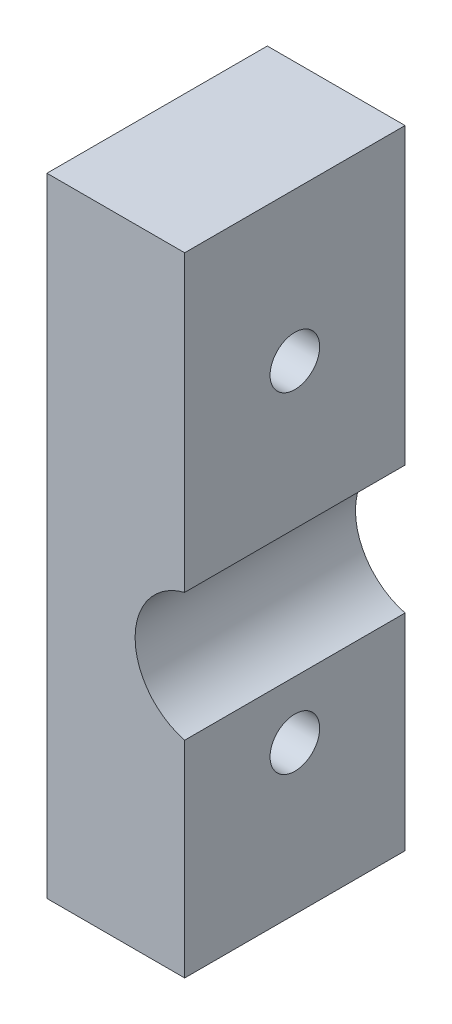
ISO-10303-21;
HEADER;
FILE_DESCRIPTION(('STEP AP214'),'2;1');
FILE_NAME('part.step','',(''),(''),'','','');
FILE_SCHEMA(('AUTOMOTIVE_DESIGN { 1 0 10303 214 1 1 1 1 }'));
ENDSEC;
DATA;
#1=APPLICATION_CONTEXT('core data for automotive mechanical design processes');
#2=APPLICATION_PROTOCOL_DEFINITION('international standard','automotive_design',2000,#1);
#3=PRODUCT_CONTEXT('',#1,'mechanical');
#4=PRODUCT('Part','Part','',(#3));
#5=PRODUCT_RELATED_PRODUCT_CATEGORY('part','',(#4));
#6=PRODUCT_DEFINITION_FORMATION('','',#4);
#7=PRODUCT_DEFINITION_CONTEXT('part definition',#1,'design');
#8=PRODUCT_DEFINITION('design','',#6,#7);
#9=PRODUCT_DEFINITION_SHAPE('','',#8);
#10=(LENGTH_UNIT() NAMED_UNIT(*) SI_UNIT(.MILLI.,.METRE.));
#11=(NAMED_UNIT(*) PLANE_ANGLE_UNIT() SI_UNIT($,.RADIAN.));
#12=(NAMED_UNIT(*) SI_UNIT($,.STERADIAN.) SOLID_ANGLE_UNIT());
#13=UNCERTAINTY_MEASURE_WITH_UNIT(LENGTH_MEASURE(1.E-05),#10,'distance_accuracy_value','');
#14=(GEOMETRIC_REPRESENTATION_CONTEXT(3) GLOBAL_UNCERTAINTY_ASSIGNED_CONTEXT((#13)) GLOBAL_UNIT_ASSIGNED_CONTEXT((#10,
#11,#12)) REPRESENTATION_CONTEXT('',''));
#15=CARTESIAN_POINT('',(0.,0.,0.));
#16=DIRECTION('',(0.,0.,1.));
#17=DIRECTION('',(1.,0.,0.));
#18=AXIS2_PLACEMENT_3D('',#15,#16,#17);
#19=CARTESIAN_POINT('',(-14.,32.5,10.));
#20=DIRECTION('',(1.,0.,0.));
#21=DIRECTION('',(0.,1.,0.));
#22=AXIS2_PLACEMENT_3D('',#19,#20,#21);
#23=PLANE('',#22);
#24=CARTESIAN_POINT('',(-14.,-11.,0.));
#25=DIRECTION('',(-1.,0.,0.));
#26=DIRECTION('',(0.,0.,1.));
#27=AXIS2_PLACEMENT_3D('',#24,#25,#26);
#28=CIRCLE('',#27,5.);
#29=CARTESIAN_POINT('',(-14.,-11.,5.));
#30=VERTEX_POINT('',#29);
#31=EDGE_CURVE('E183',#30,#30,#28,.T.);
#32=ORIENTED_EDGE('',*,*,#31,.F.);
#33=EDGE_LOOP('',(#32));
#34=FACE_BOUND('',#33,.T.);
#35=CARTESIAN_POINT('',(-14.,19.,0.));
#36=DIRECTION('',(-1.,0.,0.));
#37=DIRECTION('',(0.,0.,1.));
#38=AXIS2_PLACEMENT_3D('',#35,#36,#37);
#39=CIRCLE('',#38,5.);
#40=CARTESIAN_POINT('',(-14.,19.,5.));
#41=VERTEX_POINT('',#40);
#42=EDGE_CURVE('E150',#41,#41,#39,.T.);
#43=ORIENTED_EDGE('',*,*,#42,.F.);
#44=EDGE_LOOP('',(#43));
#45=FACE_BOUND('',#44,.T.);
#46=DIRECTION('',(0.,-1.,0.));
#47=VECTOR('',#46,1.);
#48=CARTESIAN_POINT('',(-14.,32.5,-10.));
#49=LINE('',#48,#47);
#50=CARTESIAN_POINT('',(-14.,32.5,-10.));
#51=VERTEX_POINT('',#50);
#52=CARTESIAN_POINT('',(-14.,-24.5,-10.));
#53=VERTEX_POINT('',#52);
#54=EDGE_CURVE('E124',#51,#53,#49,.T.);
#55=ORIENTED_EDGE('',*,*,#54,.T.);
#56=DIRECTION('',(0.,0.,-1.));
#57=VECTOR('',#56,1.);
#58=CARTESIAN_POINT('',(-14.,-24.5,10.));
#59=LINE('',#58,#57);
#60=CARTESIAN_POINT('',(-14.,-24.5,10.));
#61=VERTEX_POINT('',#60);
#62=EDGE_CURVE('E11',#61,#53,#59,.T.);
#63=ORIENTED_EDGE('',*,*,#62,.F.);
#64=DIRECTION('',(0.,-1.,0.));
#65=VECTOR('',#64,1.);
#66=CARTESIAN_POINT('',(-14.,32.5,10.));
#67=LINE('',#66,#65);
#68=CARTESIAN_POINT('',(-14.,32.5,10.));
#69=VERTEX_POINT('',#68);
#70=EDGE_CURVE('E135',#69,#61,#67,.T.);
#71=ORIENTED_EDGE('',*,*,#70,.F.);
#72=DIRECTION('',(0.,0.,-1.));
#73=VECTOR('',#72,1.);
#74=CARTESIAN_POINT('',(-14.,32.5,10.));
#75=LINE('',#74,#73);
#76=EDGE_CURVE('E120',#69,#51,#75,.T.);
#77=ORIENTED_EDGE('',*,*,#76,.T.);
#78=EDGE_LOOP('',(#55,#63,#71,#77));
#79=FACE_BOUND('',#78,.T.);
#80=ADVANCED_FACE('F38',(#34,#45,#79),#23,.F.);
#81=CARTESIAN_POINT('',(-14.,-24.5,10.));
#82=DIRECTION('',(0.,1.,0.));
#83=DIRECTION('',(0.,0.,1.));
#84=AXIS2_PLACEMENT_3D('',#81,#82,#83);
#85=PLANE('',#84);
#86=DIRECTION('',(1.,0.,0.));
#87=VECTOR('',#86,1.);
#88=CARTESIAN_POINT('',(-14.,-24.5,-10.));
#89=LINE('',#88,#87);
#90=CARTESIAN_POINT('',(-1.50000000000001,-24.5,-10.));
#91=VERTEX_POINT('',#90);
#92=EDGE_CURVE('E127',#53,#91,#89,.T.);
#93=ORIENTED_EDGE('',*,*,#92,.T.);
#94=DIRECTION('',(0.,0.,-1.));
#95=VECTOR('',#94,1.);
#96=CARTESIAN_POINT('',(-1.50000000000001,-24.5,10.));
#97=LINE('',#96,#95);
#98=CARTESIAN_POINT('',(-1.50000000000001,-24.5,10.));
#99=VERTEX_POINT('',#98);
#100=EDGE_CURVE('E47',#99,#91,#97,.T.);
#101=ORIENTED_EDGE('',*,*,#100,.F.);
#102=DIRECTION('',(1.,0.,0.));
#103=VECTOR('',#102,1.);
#104=CARTESIAN_POINT('',(-14.,-24.5,10.));
#105=LINE('',#104,#103);
#106=EDGE_CURVE('E93',#61,#99,#105,.T.);
#107=ORIENTED_EDGE('',*,*,#106,.F.);
#108=ORIENTED_EDGE('',*,*,#62,.T.);
#109=EDGE_LOOP('',(#93,#101,#107,#108));
#110=FACE_BOUND('',#109,.T.);
#111=ADVANCED_FACE('F157',(#110),#85,.F.);
#112=CARTESIAN_POINT('',(-1.5,-5.80947501931112,10.));
#113=DIRECTION('',(-1.,0.,0.));
#114=DIRECTION('',(0.,-1.,0.));
#115=AXIS2_PLACEMENT_3D('',#112,#113,#114);
#116=PLANE('',#115);
#117=CARTESIAN_POINT('',(-1.5,-11.,0.));
#118=DIRECTION('',(-1.,0.,0.));
#119=DIRECTION('',(0.,-1.,0.));
#120=AXIS2_PLACEMENT_3D('',#117,#118,#119);
#121=CIRCLE('',#120,2.25);
#122=CARTESIAN_POINT('',(-1.50000000000001,-13.25,0.));
#123=VERTEX_POINT('',#122);
#124=EDGE_CURVE('E41',#123,#123,#121,.T.);
#125=ORIENTED_EDGE('',*,*,#124,.T.);
#126=EDGE_LOOP('',(#125));
#127=FACE_BOUND('',#126,.T.);
#128=DIRECTION('',(0.,1.,0.));
#129=VECTOR('',#128,1.);
#130=CARTESIAN_POINT('',(-1.5,-5.80947501931112,-10.));
#131=LINE('',#130,#129);
#132=CARTESIAN_POINT('',(-1.50000000000001,-5.80947501931112,-10.));
#133=VERTEX_POINT('',#132);
#134=EDGE_CURVE('E130',#91,#133,#131,.T.);
#135=ORIENTED_EDGE('',*,*,#134,.T.);
#136=DIRECTION('',(0.,0.,-1.));
#137=VECTOR('',#136,1.);
#138=CARTESIAN_POINT('',(-1.50000000000001,-5.80947501931112,10.));
#139=LINE('',#138,#137);
#140=CARTESIAN_POINT('',(-1.50000000000001,-5.80947501931112,10.));
#141=VERTEX_POINT('',#140);
#142=EDGE_CURVE('E115',#141,#133,#139,.T.);
#143=ORIENTED_EDGE('',*,*,#142,.F.);
#144=DIRECTION('',(0.,1.,0.));
#145=VECTOR('',#144,1.);
#146=CARTESIAN_POINT('',(-1.5,-5.80947501931112,10.));
#147=LINE('',#146,#145);
#148=EDGE_CURVE('E106',#99,#141,#147,.T.);
#149=ORIENTED_EDGE('',*,*,#148,.F.);
#150=ORIENTED_EDGE('',*,*,#100,.T.);
#151=EDGE_LOOP('',(#135,#143,#149,#150));
#152=FACE_BOUND('',#151,.T.);
#153=ADVANCED_FACE('F160',(#127,#152),#116,.F.);
#154=CARTESIAN_POINT('',(0.,0.,10.));
#155=DIRECTION('',(0.,0.,-1.));
#156=DIRECTION('',(-1.,0.,0.));
#157=AXIS2_PLACEMENT_3D('',#154,#155,#156);
#158=CYLINDRICAL_SURFACE('',#157,6.);
#159=CARTESIAN_POINT('',(0.,0.,-10.));
#160=DIRECTION('',(0.,0.,-1.));
#161=DIRECTION('',(1.,0.,0.));
#162=AXIS2_PLACEMENT_3D('',#159,#160,#161);
#163=CIRCLE('',#162,6.);
#164=CARTESIAN_POINT('',(-1.5,5.80947501931112,-10.));
#165=VERTEX_POINT('',#164);
#166=EDGE_CURVE('E114',#133,#165,#163,.T.);
#167=ORIENTED_EDGE('',*,*,#166,.T.);
#168=DIRECTION('',(0.,0.,-1.));
#169=VECTOR('',#168,1.);
#170=CARTESIAN_POINT('',(-1.5,5.80947501931112,10.));
#171=LINE('',#170,#169);
#172=CARTESIAN_POINT('',(-1.5,5.80947501931112,10.));
#173=VERTEX_POINT('',#172);
#174=EDGE_CURVE('E111',#173,#165,#171,.T.);
#175=ORIENTED_EDGE('',*,*,#174,.F.);
#176=CARTESIAN_POINT('',(0.,0.,10.));
#177=DIRECTION('',(0.,0.,-1.));
#178=DIRECTION('',(1.,0.,0.));
#179=AXIS2_PLACEMENT_3D('',#176,#177,#178);
#180=CIRCLE('',#179,6.);
#181=EDGE_CURVE('E100',#141,#173,#180,.T.);
#182=ORIENTED_EDGE('',*,*,#181,.F.);
#183=ORIENTED_EDGE('',*,*,#142,.T.);
#184=EDGE_LOOP('',(#167,#175,#182,#183));
#185=FACE_BOUND('',#184,.T.);
#186=ADVANCED_FACE('F112',(#185),#158,.F.);
#187=CARTESIAN_POINT('',(-1.5,32.5,10.));
#188=DIRECTION('',(-1.,0.,0.));
#189=DIRECTION('',(0.,-1.,0.));
#190=AXIS2_PLACEMENT_3D('',#187,#188,#189);
#191=PLANE('',#190);
#192=CARTESIAN_POINT('',(-1.5,19.,0.));
#193=DIRECTION('',(-1.,0.,0.));
#194=DIRECTION('',(0.,-1.,0.));
#195=AXIS2_PLACEMENT_3D('',#192,#193,#194);
#196=CIRCLE('',#195,2.25);
#197=CARTESIAN_POINT('',(-1.5,16.75,0.));
#198=VERTEX_POINT('',#197);
#199=EDGE_CURVE('E128',#198,#198,#196,.T.);
#200=ORIENTED_EDGE('',*,*,#199,.T.);
#201=EDGE_LOOP('',(#200));
#202=FACE_BOUND('',#201,.T.);
#203=DIRECTION('',(0.,1.,0.));
#204=VECTOR('',#203,1.);
#205=CARTESIAN_POINT('',(-1.5,32.5,-10.));
#206=LINE('',#205,#204);
#207=CARTESIAN_POINT('',(-1.5,32.5,-10.));
#208=VERTEX_POINT('',#207);
#209=EDGE_CURVE('E79',#165,#208,#206,.T.);
#210=ORIENTED_EDGE('',*,*,#209,.T.);
#211=DIRECTION('',(0.,0.,-1.));
#212=VECTOR('',#211,1.);
#213=CARTESIAN_POINT('',(-1.5,32.5,10.));
#214=LINE('',#213,#212);
#215=CARTESIAN_POINT('',(-1.5,32.5,10.));
#216=VERTEX_POINT('',#215);
#217=EDGE_CURVE('E116',#216,#208,#214,.T.);
#218=ORIENTED_EDGE('',*,*,#217,.F.);
#219=DIRECTION('',(0.,1.,0.));
#220=VECTOR('',#219,1.);
#221=CARTESIAN_POINT('',(-1.5,32.5,10.));
#222=LINE('',#221,#220);
#223=EDGE_CURVE('E104',#173,#216,#222,.T.);
#224=ORIENTED_EDGE('',*,*,#223,.F.);
#225=ORIENTED_EDGE('',*,*,#174,.T.);
#226=EDGE_LOOP('',(#210,#218,#224,#225));
#227=FACE_BOUND('',#226,.T.);
#228=ADVANCED_FACE('F118',(#202,#227),#191,.F.);
#229=CARTESIAN_POINT('',(-14.,32.5,10.));
#230=DIRECTION('',(0.,-1.,0.));
#231=DIRECTION('',(0.,0.,-1.));
#232=AXIS2_PLACEMENT_3D('',#229,#230,#231);
#233=PLANE('',#232);
#234=DIRECTION('',(-1.,0.,0.));
#235=VECTOR('',#234,1.);
#236=CARTESIAN_POINT('',(-14.,32.5,-10.));
#237=LINE('',#236,#235);
#238=EDGE_CURVE('E85',#208,#51,#237,.T.);
#239=ORIENTED_EDGE('',*,*,#238,.T.);
#240=ORIENTED_EDGE('',*,*,#76,.F.);
#241=DIRECTION('',(-1.,0.,0.));
#242=VECTOR('',#241,1.);
#243=CARTESIAN_POINT('',(-14.,32.5,10.));
#244=LINE('',#243,#242);
#245=EDGE_CURVE('E56',#216,#69,#244,.T.);
#246=ORIENTED_EDGE('',*,*,#245,.F.);
#247=ORIENTED_EDGE('',*,*,#217,.T.);
#248=EDGE_LOOP('',(#239,#240,#246,#247));
#249=FACE_BOUND('',#248,.T.);
#250=ADVANCED_FACE('F165',(#249),#233,.F.);
#251=CARTESIAN_POINT('',(0.,0.,10.));
#252=DIRECTION('',(0.,0.,1.));
#253=DIRECTION('',(1.,0.,0.));
#254=AXIS2_PLACEMENT_3D('',#251,#252,#253);
#255=PLANE('',#254);
#256=ORIENTED_EDGE('',*,*,#70,.T.);
#257=ORIENTED_EDGE('',*,*,#106,.T.);
#258=ORIENTED_EDGE('',*,*,#148,.T.);
#259=ORIENTED_EDGE('',*,*,#181,.T.);
#260=ORIENTED_EDGE('',*,*,#223,.T.);
#261=ORIENTED_EDGE('',*,*,#245,.T.);
#262=EDGE_LOOP('',(#256,#257,#258,#259,#260,#261));
#263=FACE_BOUND('',#262,.T.);
#264=ADVANCED_FACE('F102',(#263),#255,.T.);
#265=CARTESIAN_POINT('',(0.,0.,-10.));
#266=DIRECTION('',(0.,0.,1.));
#267=DIRECTION('',(1.,0.,0.));
#268=AXIS2_PLACEMENT_3D('',#265,#266,#267);
#269=PLANE('',#268);
#270=ORIENTED_EDGE('',*,*,#54,.F.);
#271=ORIENTED_EDGE('',*,*,#238,.F.);
#272=ORIENTED_EDGE('',*,*,#209,.F.);
#273=ORIENTED_EDGE('',*,*,#166,.F.);
#274=ORIENTED_EDGE('',*,*,#134,.F.);
#275=ORIENTED_EDGE('',*,*,#92,.F.);
#276=EDGE_LOOP('',(#270,#271,#272,#273,#274,#275));
#277=FACE_BOUND('',#276,.T.);
#278=ADVANCED_FACE('F163',(#277),#269,.F.);
#279=CARTESIAN_POINT('',(-14.,19.,0.));
#280=DIRECTION('',(-1.,0.,0.));
#281=DIRECTION('',(0.,0.,1.));
#282=AXIS2_PLACEMENT_3D('',#279,#280,#281);
#283=CYLINDRICAL_SURFACE('',#282,2.25);
#284=CARTESIAN_POINT('',(-8.09999999999999,19.,0.));
#285=DIRECTION('',(-1.,0.,0.));
#286=DIRECTION('',(0.,0.,1.));
#287=AXIS2_PLACEMENT_3D('',#284,#285,#286);
#288=CIRCLE('',#287,2.25);
#289=CARTESIAN_POINT('',(-8.09999999999999,19.,2.25));
#290=VERTEX_POINT('',#289);
#291=EDGE_CURVE('E141',#290,#290,#288,.T.);
#292=ORIENTED_EDGE('',*,*,#291,.T.);
#293=EDGE_LOOP('',(#292));
#294=FACE_BOUND('',#293,.T.);
#295=ORIENTED_EDGE('',*,*,#199,.F.);
#296=EDGE_LOOP('',(#295));
#297=FACE_BOUND('',#296,.T.);
#298=ADVANCED_FACE('F219',(#294,#297),#283,.F.);
#299=CARTESIAN_POINT('',(-8.09999999999999,21.25,0.));
#300=DIRECTION('',(1.,0.,0.));
#301=DIRECTION('',(0.,0.,-1.));
#302=AXIS2_PLACEMENT_3D('',#299,#300,#301);
#303=PLANE('',#302);
#304=ORIENTED_EDGE('',*,*,#291,.F.);
#305=EDGE_LOOP('',(#304));
#306=FACE_BOUND('',#305,.T.);
#307=CARTESIAN_POINT('',(-8.09999999999999,19.,0.));
#308=DIRECTION('',(-1.,0.,0.));
#309=DIRECTION('',(0.,0.,1.));
#310=AXIS2_PLACEMENT_3D('',#307,#308,#309);
#311=CIRCLE('',#310,5.);
#312=CARTESIAN_POINT('',(-8.09999999999999,19.,5.));
#313=VERTEX_POINT('',#312);
#314=EDGE_CURVE('E145',#313,#313,#311,.T.);
#315=ORIENTED_EDGE('',*,*,#314,.T.);
#316=EDGE_LOOP('',(#315));
#317=FACE_BOUND('',#316,.T.);
#318=ADVANCED_FACE('F215',(#306,#317),#303,.F.);
#319=CARTESIAN_POINT('',(-14.,19.,0.));
#320=DIRECTION('',(-1.,0.,0.));
#321=DIRECTION('',(0.,0.,1.));
#322=AXIS2_PLACEMENT_3D('',#319,#320,#321);
#323=CYLINDRICAL_SURFACE('',#322,5.);
#324=ORIENTED_EDGE('',*,*,#314,.F.);
#325=EDGE_LOOP('',(#324));
#326=FACE_BOUND('',#325,.T.);
#327=ORIENTED_EDGE('',*,*,#42,.T.);
#328=EDGE_LOOP('',(#327));
#329=FACE_BOUND('',#328,.T.);
#330=ADVANCED_FACE('F211',(#326,#329),#323,.F.);
#331=CARTESIAN_POINT('',(-14.,-11.,0.));
#332=DIRECTION('',(-1.,0.,0.));
#333=DIRECTION('',(0.,0.,1.));
#334=AXIS2_PLACEMENT_3D('',#331,#332,#333);
#335=CYLINDRICAL_SURFACE('',#334,2.25);
#336=CARTESIAN_POINT('',(-8.09999999999999,-11.,0.));
#337=DIRECTION('',(-1.,0.,0.));
#338=DIRECTION('',(0.,0.,1.));
#339=AXIS2_PLACEMENT_3D('',#336,#337,#338);
#340=CIRCLE('',#339,2.25);
#341=CARTESIAN_POINT('',(-8.09999999999999,-11.,2.25));
#342=VERTEX_POINT('',#341);
#343=EDGE_CURVE('E188',#342,#342,#340,.T.);
#344=ORIENTED_EDGE('',*,*,#343,.T.);
#345=EDGE_LOOP('',(#344));
#346=FACE_BOUND('',#345,.T.);
#347=ORIENTED_EDGE('',*,*,#124,.F.);
#348=EDGE_LOOP('',(#347));
#349=FACE_BOUND('',#348,.T.);
#350=ADVANCED_FACE('F204',(#346,#349),#335,.F.);
#351=CARTESIAN_POINT('',(-8.09999999999999,-8.75,0.));
#352=DIRECTION('',(1.,0.,0.));
#353=DIRECTION('',(0.,0.,-1.));
#354=AXIS2_PLACEMENT_3D('',#351,#352,#353);
#355=PLANE('',#354);
#356=ORIENTED_EDGE('',*,*,#343,.F.);
#357=EDGE_LOOP('',(#356));
#358=FACE_BOUND('',#357,.T.);
#359=CARTESIAN_POINT('',(-8.09999999999999,-11.,0.));
#360=DIRECTION('',(-1.,0.,0.));
#361=DIRECTION('',(0.,0.,1.));
#362=AXIS2_PLACEMENT_3D('',#359,#360,#361);
#363=CIRCLE('',#362,5.);
#364=CARTESIAN_POINT('',(-8.09999999999999,-11.,5.));
#365=VERTEX_POINT('',#364);
#366=EDGE_CURVE('E192',#365,#365,#363,.T.);
#367=ORIENTED_EDGE('',*,*,#366,.T.);
#368=EDGE_LOOP('',(#367));
#369=FACE_BOUND('',#368,.T.);
#370=ADVANCED_FACE('F198',(#358,#369),#355,.F.);
#371=CARTESIAN_POINT('',(-14.,-11.,0.));
#372=DIRECTION('',(-1.,0.,0.));
#373=DIRECTION('',(0.,0.,1.));
#374=AXIS2_PLACEMENT_3D('',#371,#372,#373);
#375=CYLINDRICAL_SURFACE('',#374,5.);
#376=ORIENTED_EDGE('',*,*,#366,.F.);
#377=EDGE_LOOP('',(#376));
#378=FACE_BOUND('',#377,.T.);
#379=ORIENTED_EDGE('',*,*,#31,.T.);
#380=EDGE_LOOP('',(#379));
#381=FACE_BOUND('',#380,.T.);
#382=ADVANCED_FACE('F196',(#378,#381),#375,.F.);
#383=CLOSED_SHELL('',(#80,#111,#153,#186,#228,#250,#264,#278,#298,#318,#330,#350,#370,#382));
#384=MANIFOLD_SOLID_BREP('B2',#383);
#385=ADVANCED_BREP_SHAPE_REPRESENTATION('',(#18,#384),#14);
#386=SHAPE_DEFINITION_REPRESENTATION(#9,#385);
ENDSEC;
END-ISO-10303-21;
